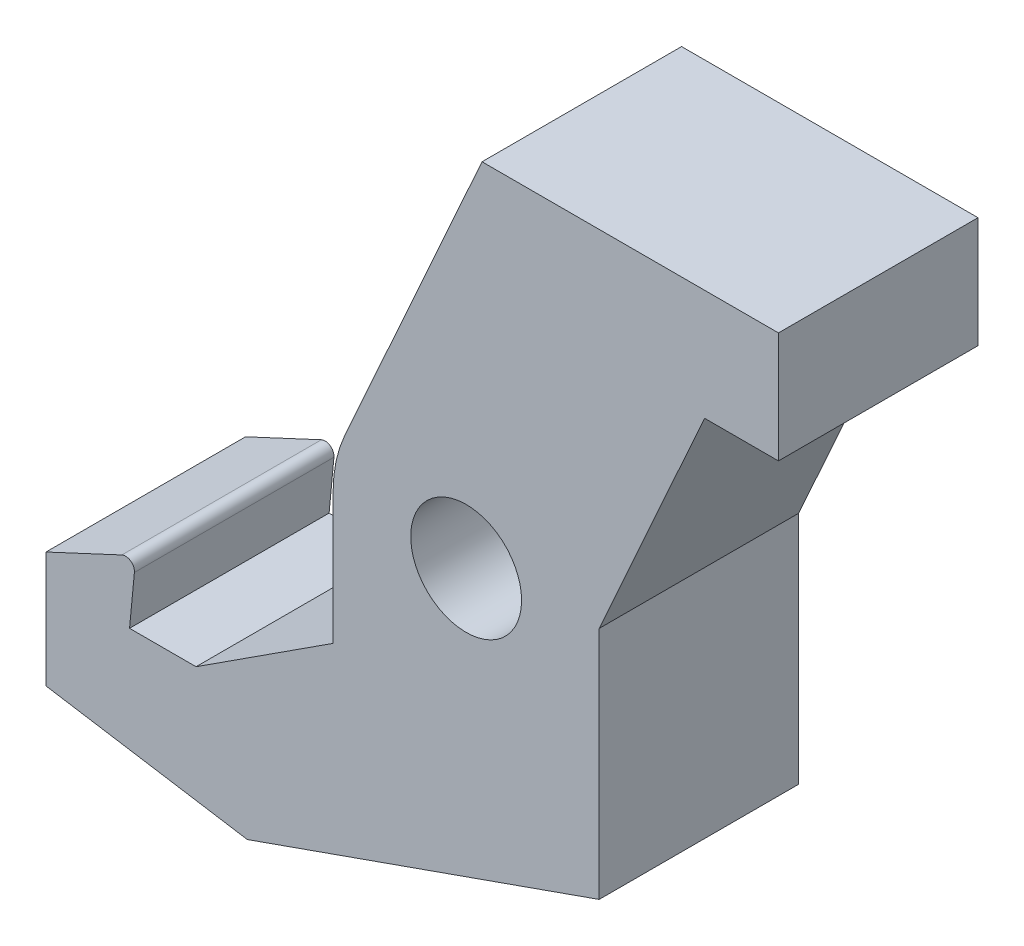
ISO-10303-21;
HEADER;
FILE_DESCRIPTION(('STEP AP214'),'2;1');
FILE_NAME('part.step','',(''),(''),'','','');
FILE_SCHEMA(('AUTOMOTIVE_DESIGN { 1 0 10303 214 1 1 1 1 }'));
ENDSEC;
DATA;
#1=APPLICATION_CONTEXT('core data for automotive mechanical design processes');
#2=APPLICATION_PROTOCOL_DEFINITION('international standard','automotive_design',2000,#1);
#3=PRODUCT_CONTEXT('',#1,'mechanical');
#4=PRODUCT('Part','Part','',(#3));
#5=PRODUCT_RELATED_PRODUCT_CATEGORY('part','',(#4));
#6=PRODUCT_DEFINITION_FORMATION('','',#4);
#7=PRODUCT_DEFINITION_CONTEXT('part definition',#1,'design');
#8=PRODUCT_DEFINITION('design','',#6,#7);
#9=PRODUCT_DEFINITION_SHAPE('','',#8);
#10=(LENGTH_UNIT() NAMED_UNIT(*) SI_UNIT(.MILLI.,.METRE.));
#11=(NAMED_UNIT(*) PLANE_ANGLE_UNIT() SI_UNIT($,.RADIAN.));
#12=(NAMED_UNIT(*) SI_UNIT($,.STERADIAN.) SOLID_ANGLE_UNIT());
#13=UNCERTAINTY_MEASURE_WITH_UNIT(LENGTH_MEASURE(1.E-05),#10,'distance_accuracy_value','');
#14=(GEOMETRIC_REPRESENTATION_CONTEXT(3) GLOBAL_UNCERTAINTY_ASSIGNED_CONTEXT((#13)) GLOBAL_UNIT_ASSIGNED_CONTEXT((#10,
#11,#12)) REPRESENTATION_CONTEXT('',''));
#15=CARTESIAN_POINT('',(0.,0.,0.));
#16=DIRECTION('',(0.,0.,1.));
#17=DIRECTION('',(1.,0.,0.));
#18=AXIS2_PLACEMENT_3D('',#15,#16,#17);
#19=CARTESIAN_POINT('',(-14.1034505740258,1.34798128388892,9.));
#20=DIRECTION('',(-0.995463469492192,0.0951445264141177,0.));
#21=DIRECTION('',(-0.0951445264141177,-0.995463469492193,0.));
#22=AXIS2_PLACEMENT_3D('',#19,#20,#21);
#23=PLANE('',#22);
#24=DIRECTION('',(0.0951445264141177,0.995463469492193,0.));
#25=VECTOR('',#24,1.);
#26=CARTESIAN_POINT('',(-14.1034505740258,1.34798128388892,0.));
#27=LINE('',#26,#25);
#28=CARTESIAN_POINT('',(-15.1814621634101,-9.93087202870755,0.));
#29=VERTEX_POINT('',#28);
#30=CARTESIAN_POINT('',(-14.9625493218934,-7.6404645302864,0.));
#31=VERTEX_POINT('',#30);
#32=EDGE_CURVE('E183',#29,#31,#27,.T.);
#33=ORIENTED_EDGE('',*,*,#32,.T.);
#34=DIRECTION('',(0.,0.,-1.));
#35=VECTOR('',#34,1.);
#36=CARTESIAN_POINT('',(-14.9625493218934,-7.6404645302864,9.));
#37=LINE('',#36,#35);
#38=CARTESIAN_POINT('',(-14.9625493218934,-7.6404645302864,9.));
#39=VERTEX_POINT('',#38);
#40=EDGE_CURVE('E11',#39,#31,#37,.T.);
#41=ORIENTED_EDGE('',*,*,#40,.F.);
#42=DIRECTION('',(0.0951445264141177,0.995463469492193,0.));
#43=VECTOR('',#42,1.);
#44=CARTESIAN_POINT('',(-14.1034505740258,1.34798128388892,9.));
#45=LINE('',#44,#43);
#46=CARTESIAN_POINT('',(-15.1814621634101,-9.93087202870755,9.));
#47=VERTEX_POINT('',#46);
#48=EDGE_CURVE('E298',#47,#39,#45,.T.);
#49=ORIENTED_EDGE('',*,*,#48,.F.);
#50=DIRECTION('',(0.,0.,-1.));
#51=VECTOR('',#50,1.);
#52=CARTESIAN_POINT('',(-15.1814621634101,-9.93087202870755,9.));
#53=LINE('',#52,#51);
#54=EDGE_CURVE('E176',#47,#29,#53,.T.);
#55=ORIENTED_EDGE('',*,*,#54,.T.);
#56=EDGE_LOOP('',(#33,#41,#49,#55));
#57=FACE_BOUND('',#56,.T.);
#58=ADVANCED_FACE('F35',(#57),#23,.F.);
#59=CARTESIAN_POINT('',(-15.3607347096903,-7.60240671972075,9.));
#60=DIRECTION('',(0.,0.,-1.));
#61=DIRECTION('',(-1.,0.,0.));
#62=AXIS2_PLACEMENT_3D('',#59,#60,#61);
#63=CYLINDRICAL_SURFACE('',#62,0.399999999999999);
#64=CARTESIAN_POINT('',(-15.3607347096903,-7.60240671972075,0.));
#65=DIRECTION('',(0.,0.,1.));
#66=DIRECTION('',(1.,0.,0.));
#67=AXIS2_PLACEMENT_3D('',#64,#65,#66);
#68=CIRCLE('',#67,0.399999999999999);
#69=CARTESIAN_POINT('',(-15.5297246389411,-7.23985685582368,0.));
#70=VERTEX_POINT('',#69);
#71=EDGE_CURVE('E186',#31,#70,#68,.T.);
#72=ORIENTED_EDGE('',*,*,#71,.T.);
#73=DIRECTION('',(0.,0.,-1.));
#74=VECTOR('',#73,1.);
#75=CARTESIAN_POINT('',(-15.5297246389411,-7.23985685582368,9.));
#76=LINE('',#75,#74);
#77=CARTESIAN_POINT('',(-15.5297246389411,-7.23985685582368,9.));
#78=VERTEX_POINT('',#77);
#79=EDGE_CURVE('E44',#78,#70,#76,.T.);
#80=ORIENTED_EDGE('',*,*,#79,.F.);
#81=CARTESIAN_POINT('',(-15.3607347096903,-7.60240671972075,9.));
#82=DIRECTION('',(0.,0.,1.));
#83=DIRECTION('',(1.,0.,0.));
#84=AXIS2_PLACEMENT_3D('',#81,#82,#83);
#85=CIRCLE('',#84,0.399999999999999);
#86=EDGE_CURVE('E119',#39,#78,#85,.T.);
#87=ORIENTED_EDGE('',*,*,#86,.F.);
#88=ORIENTED_EDGE('',*,*,#40,.T.);
#89=EDGE_LOOP('',(#72,#80,#87,#88));
#90=FACE_BOUND('',#89,.T.);
#91=ADVANCED_FACE('F312',(#90),#63,.T.);
#92=CARTESIAN_POINT('',(0.000466887164870625,-0.00100165660065969,9.));
#93=DIRECTION('',(0.42247482312715,-0.906374659742693,0.));
#94=DIRECTION('',(0.906374659742693,0.42247482312715,0.));
#95=AXIS2_PLACEMENT_3D('',#92,#93,#94);
#96=PLANE('',#95);
#97=DIRECTION('',(-0.906374659742694,-0.42247482312715,0.));
#98=VECTOR('',#97,1.);
#99=CARTESIAN_POINT('',(0.000466887164870625,-0.00100165660065969,0.));
#100=LINE('',#99,#98);
#101=CARTESIAN_POINT('',(-18.9497048612167,-8.83396093185158,0.));
#102=VERTEX_POINT('',#101);
#103=EDGE_CURVE('E188',#70,#102,#100,.T.);
#104=ORIENTED_EDGE('',*,*,#103,.T.);
#105=DIRECTION('',(0.,0.,-1.));
#106=VECTOR('',#105,1.);
#107=CARTESIAN_POINT('',(-18.9497048612167,-8.83396093185158,9.));
#108=LINE('',#107,#106);
#109=CARTESIAN_POINT('',(-18.9497048612167,-8.83396093185158,9.));
#110=VERTEX_POINT('',#109);
#111=EDGE_CURVE('E244',#110,#102,#108,.T.);
#112=ORIENTED_EDGE('',*,*,#111,.F.);
#113=DIRECTION('',(-0.906374659742694,-0.42247482312715,0.));
#114=VECTOR('',#113,1.);
#115=CARTESIAN_POINT('',(0.000466887164870625,-0.00100165660065969,9.));
#116=LINE('',#115,#114);
#117=EDGE_CURVE('E252',#78,#110,#116,.T.);
#118=ORIENTED_EDGE('',*,*,#117,.F.);
#119=ORIENTED_EDGE('',*,*,#79,.T.);
#120=EDGE_LOOP('',(#104,#112,#118,#119));
#121=FACE_BOUND('',#120,.T.);
#122=ADVANCED_FACE('F250',(#121),#96,.F.);
#123=CARTESIAN_POINT('',(-18.9497048612167,0.,9.));
#124=DIRECTION('',(1.,0.,0.));
#125=DIRECTION('',(0.,0.,-1.));
#126=AXIS2_PLACEMENT_3D('',#123,#124,#125);
#127=PLANE('',#126);
#128=DIRECTION('',(0.,-1.,0.));
#129=VECTOR('',#128,1.);
#130=CARTESIAN_POINT('',(-18.9497048612167,0.,0.));
#131=LINE('',#130,#129);
#132=CARTESIAN_POINT('',(-18.9497048612167,-14.0674182249291,0.));
#133=VERTEX_POINT('',#132);
#134=EDGE_CURVE('E190',#102,#133,#131,.T.);
#135=ORIENTED_EDGE('',*,*,#134,.T.);
#136=DIRECTION('',(0.,0.,-1.));
#137=VECTOR('',#136,1.);
#138=CARTESIAN_POINT('',(-18.9497048612167,-14.0674182249291,9.));
#139=LINE('',#138,#137);
#140=CARTESIAN_POINT('',(-18.9497048612167,-14.0674182249291,9.));
#141=VERTEX_POINT('',#140);
#142=EDGE_CURVE('E242',#141,#133,#139,.T.);
#143=ORIENTED_EDGE('',*,*,#142,.F.);
#144=DIRECTION('',(0.,-1.,0.));
#145=VECTOR('',#144,1.);
#146=CARTESIAN_POINT('',(-18.9497048612167,0.,9.));
#147=LINE('',#146,#145);
#148=EDGE_CURVE('E263',#110,#141,#147,.T.);
#149=ORIENTED_EDGE('',*,*,#148,.F.);
#150=ORIENTED_EDGE('',*,*,#111,.T.);
#151=EDGE_LOOP('',(#135,#143,#149,#150));
#152=FACE_BOUND('',#151,.T.);
#153=ADVANCED_FACE('F260',(#152),#127,.F.);
#154=CARTESIAN_POINT('',(-2.68188596345128,-16.6826209182928,9.));
#155=DIRECTION('',(-0.158721391149819,-0.987323412054766,0.));
#156=DIRECTION('',(0.987323412054767,-0.158721391149819,0.));
#157=AXIS2_PLACEMENT_3D('',#154,#155,#156);
#158=PLANE('',#157);
#159=DIRECTION('',(-0.987323412054766,0.158721391149819,0.));
#160=VECTOR('',#159,1.);
#161=CARTESIAN_POINT('',(-2.68188596345128,-16.6826209182928,0.));
#162=LINE('',#161,#160);
#163=CARTESIAN_POINT('',(-9.87153624063795,-15.52681798691,0.));
#164=VERTEX_POINT('',#163);
#165=EDGE_CURVE('E193',#164,#133,#162,.T.);
#166=ORIENTED_EDGE('',*,*,#165,.F.);
#167=DIRECTION('',(0.,0.,-1.));
#168=VECTOR('',#167,1.);
#169=CARTESIAN_POINT('',(-9.87153624063795,-15.52681798691,9.));
#170=LINE('',#169,#168);
#171=CARTESIAN_POINT('',(-9.87153624063795,-15.52681798691,9.));
#172=VERTEX_POINT('',#171);
#173=EDGE_CURVE('E240',#172,#164,#170,.T.);
#174=ORIENTED_EDGE('',*,*,#173,.F.);
#175=DIRECTION('',(-0.987323412054766,0.158721391149819,0.));
#176=VECTOR('',#175,1.);
#177=CARTESIAN_POINT('',(-2.68188596345128,-16.6826209182928,9.));
#178=LINE('',#177,#176);
#179=EDGE_CURVE('E265',#172,#141,#178,.T.);
#180=ORIENTED_EDGE('',*,*,#179,.T.);
#181=ORIENTED_EDGE('',*,*,#142,.T.);
#182=EDGE_LOOP('',(#166,#174,#180,#181));
#183=FACE_BOUND('',#182,.T.);
#184=ADVANCED_FACE('F322',(#183),#158,.T.);
#185=CARTESIAN_POINT('',(3.77766236711659,-10.7144181899577,9.));
#186=DIRECTION('',(0.332515077437282,-0.943097939387463,0.));
#187=DIRECTION('',(0.943097939387463,0.332515077437282,0.));
#188=AXIS2_PLACEMENT_3D('',#185,#186,#187);
#189=PLANE('',#188);
#190=DIRECTION('',(-0.943097939387463,-0.332515077437282,0.));
#191=VECTOR('',#190,1.);
#192=CARTESIAN_POINT('',(3.77766236711659,-10.7144181899577,0.));
#193=LINE('',#192,#191);
#194=CARTESIAN_POINT('',(6.,-9.93087202870755,0.));
#195=VERTEX_POINT('',#194);
#196=EDGE_CURVE('E196',#195,#164,#193,.T.);
#197=ORIENTED_EDGE('',*,*,#196,.F.);
#198=DIRECTION('',(0.,0.,-1.));
#199=VECTOR('',#198,1.);
#200=CARTESIAN_POINT('',(6.,-9.93087202870755,9.));
#201=LINE('',#200,#199);
#202=CARTESIAN_POINT('',(6.,-9.93087202870755,9.));
#203=VERTEX_POINT('',#202);
#204=EDGE_CURVE('E238',#203,#195,#201,.T.);
#205=ORIENTED_EDGE('',*,*,#204,.F.);
#206=DIRECTION('',(-0.943097939387463,-0.332515077437282,0.));
#207=VECTOR('',#206,1.);
#208=CARTESIAN_POINT('',(3.77766236711659,-10.7144181899577,9.));
#209=LINE('',#208,#207);
#210=EDGE_CURVE('E267',#203,#172,#209,.T.);
#211=ORIENTED_EDGE('',*,*,#210,.T.);
#212=ORIENTED_EDGE('',*,*,#173,.T.);
#213=EDGE_LOOP('',(#197,#205,#211,#212));
#214=FACE_BOUND('',#213,.T.);
#215=ADVANCED_FACE('F325',(#214),#189,.T.);
#216=CARTESIAN_POINT('',(6.,0.,9.));
#217=DIRECTION('',(-1.,0.,0.));
#218=DIRECTION('',(0.,0.,1.));
#219=AXIS2_PLACEMENT_3D('',#216,#217,#218);
#220=PLANE('',#219);
#221=DIRECTION('',(0.,1.,0.));
#222=VECTOR('',#221,1.);
#223=CARTESIAN_POINT('',(6.,0.,0.));
#224=LINE('',#223,#222);
#225=CARTESIAN_POINT('',(6.,0.655573525872559,0.));
#226=VERTEX_POINT('',#225);
#227=EDGE_CURVE('E199',#195,#226,#224,.T.);
#228=ORIENTED_EDGE('',*,*,#227,.T.);
#229=DIRECTION('',(0.,0.,-1.));
#230=VECTOR('',#229,1.);
#231=CARTESIAN_POINT('',(6.,0.655573525872559,9.));
#232=LINE('',#231,#230);
#233=CARTESIAN_POINT('',(6.,0.655573525872559,9.));
#234=VERTEX_POINT('',#233);
#235=EDGE_CURVE('E235',#234,#226,#232,.T.);
#236=ORIENTED_EDGE('',*,*,#235,.F.);
#237=DIRECTION('',(0.,1.,0.));
#238=VECTOR('',#237,1.);
#239=CARTESIAN_POINT('',(6.,0.,9.));
#240=LINE('',#239,#238);
#241=EDGE_CURVE('E274',#203,#234,#240,.T.);
#242=ORIENTED_EDGE('',*,*,#241,.F.);
#243=ORIENTED_EDGE('',*,*,#204,.T.);
#244=EDGE_LOOP('',(#228,#236,#242,#243));
#245=FACE_BOUND('',#244,.T.);
#246=ADVANCED_FACE('F329',(#245),#220,.F.);
#247=CARTESIAN_POINT('',(4.747991842048,-2.13228817130656,9.));
#248=DIRECTION('',(-0.912230997214208,0.409676223036647,0.));
#249=DIRECTION('',(-0.409676223036647,-0.912230997214208,0.));
#250=AXIS2_PLACEMENT_3D('',#247,#248,#249);
#251=PLANE('',#250);
#252=DIRECTION('',(0.409676223036647,0.912230997214208,0.));
#253=VECTOR('',#252,1.);
#254=CARTESIAN_POINT('',(4.747991842048,-2.13228817130656,0.));
#255=LINE('',#254,#253);
#256=CARTESIAN_POINT('',(10.7542947383151,11.2420190804527,0.));
#257=VERTEX_POINT('',#256);
#258=EDGE_CURVE('E201',#226,#257,#255,.T.);
#259=ORIENTED_EDGE('',*,*,#258,.T.);
#260=DIRECTION('',(0.,0.,-1.));
#261=VECTOR('',#260,1.);
#262=CARTESIAN_POINT('',(10.7542947383151,11.2420190804527,9.));
#263=LINE('',#262,#261);
#264=CARTESIAN_POINT('',(10.7542947383151,11.2420190804527,9.));
#265=VERTEX_POINT('',#264);
#266=EDGE_CURVE('E232',#265,#257,#263,.T.);
#267=ORIENTED_EDGE('',*,*,#266,.F.);
#268=DIRECTION('',(0.409676223036647,0.912230997214208,0.));
#269=VECTOR('',#268,1.);
#270=CARTESIAN_POINT('',(4.747991842048,-2.13228817130656,9.));
#271=LINE('',#270,#269);
#272=EDGE_CURVE('E276',#234,#265,#271,.T.);
#273=ORIENTED_EDGE('',*,*,#272,.F.);
#274=ORIENTED_EDGE('',*,*,#235,.T.);
#275=EDGE_LOOP('',(#259,#267,#273,#274));
#276=FACE_BOUND('',#275,.T.);
#277=ADVANCED_FACE('F333',(#276),#251,.F.);
#278=CARTESIAN_POINT('',(0.,11.2420190804527,9.));
#279=DIRECTION('',(0.,1.,0.));
#280=DIRECTION('',(0.,0.,1.));
#281=AXIS2_PLACEMENT_3D('',#278,#279,#280);
#282=PLANE('',#281);
#283=DIRECTION('',(1.,0.,0.));
#284=VECTOR('',#283,1.);
#285=CARTESIAN_POINT('',(0.,11.2420190804527,0.));
#286=LINE('',#285,#284);
#287=CARTESIAN_POINT('',(14.0864349101098,11.2420190804527,0.));
#288=VERTEX_POINT('',#287);
#289=EDGE_CURVE('E203',#257,#288,#286,.T.);
#290=ORIENTED_EDGE('',*,*,#289,.T.);
#291=DIRECTION('',(0.,0.,-1.));
#292=VECTOR('',#291,1.);
#293=CARTESIAN_POINT('',(14.0864349101098,11.2420190804527,9.));
#294=LINE('',#293,#292);
#295=CARTESIAN_POINT('',(14.0864349101098,11.2420190804527,9.));
#296=VERTEX_POINT('',#295);
#297=EDGE_CURVE('E229',#296,#288,#294,.T.);
#298=ORIENTED_EDGE('',*,*,#297,.F.);
#299=DIRECTION('',(1.,0.,0.));
#300=VECTOR('',#299,1.);
#301=CARTESIAN_POINT('',(0.,11.2420190804527,9.));
#302=LINE('',#301,#300);
#303=EDGE_CURVE('E278',#265,#296,#302,.T.);
#304=ORIENTED_EDGE('',*,*,#303,.F.);
#305=ORIENTED_EDGE('',*,*,#266,.T.);
#306=EDGE_LOOP('',(#290,#298,#304,#305));
#307=FACE_BOUND('',#306,.T.);
#308=ADVANCED_FACE('F337',(#307),#282,.F.);
#309=CARTESIAN_POINT('',(14.0864349101098,0.,9.));
#310=DIRECTION('',(-1.,0.,0.));
#311=DIRECTION('',(0.,0.,1.));
#312=AXIS2_PLACEMENT_3D('',#309,#310,#311);
#313=PLANE('',#312);
#314=DIRECTION('',(0.,1.,0.));
#315=VECTOR('',#314,1.);
#316=CARTESIAN_POINT('',(14.0864349101098,0.,0.));
#317=LINE('',#316,#315);
#318=CARTESIAN_POINT('',(14.0864349101098,16.2420190804527,0.));
#319=VERTEX_POINT('',#318);
#320=EDGE_CURVE('E205',#288,#319,#317,.T.);
#321=ORIENTED_EDGE('',*,*,#320,.T.);
#322=DIRECTION('',(0.,0.,-1.));
#323=VECTOR('',#322,1.);
#324=CARTESIAN_POINT('',(14.0864349101098,16.2420190804527,9.));
#325=LINE('',#324,#323);
#326=CARTESIAN_POINT('',(14.0864349101098,16.2420190804527,9.));
#327=VERTEX_POINT('',#326);
#328=EDGE_CURVE('E226',#327,#319,#325,.T.);
#329=ORIENTED_EDGE('',*,*,#328,.F.);
#330=DIRECTION('',(0.,1.,0.));
#331=VECTOR('',#330,1.);
#332=CARTESIAN_POINT('',(14.0864349101098,0.,9.));
#333=LINE('',#332,#331);
#334=EDGE_CURVE('E280',#296,#327,#333,.T.);
#335=ORIENTED_EDGE('',*,*,#334,.F.);
#336=ORIENTED_EDGE('',*,*,#297,.T.);
#337=EDGE_LOOP('',(#321,#329,#335,#336));
#338=FACE_BOUND('',#337,.T.);
#339=ADVANCED_FACE('F341',(#338),#313,.F.);
#340=CARTESIAN_POINT('',(0.,16.2420190804527,9.));
#341=DIRECTION('',(0.,-1.,0.));
#342=DIRECTION('',(0.,0.,-1.));
#343=AXIS2_PLACEMENT_3D('',#340,#341,#342);
#344=PLANE('',#343);
#345=DIRECTION('',(-1.,0.,0.));
#346=VECTOR('',#345,1.);
#347=CARTESIAN_POINT('',(0.,16.2420190804527,0.));
#348=LINE('',#347,#346);
#349=CARTESIAN_POINT('',(0.716889727893603,16.2420190804527,0.));
#350=VERTEX_POINT('',#349);
#351=EDGE_CURVE('E207',#319,#350,#348,.T.);
#352=ORIENTED_EDGE('',*,*,#351,.T.);
#353=DIRECTION('',(0.,0.,-1.));
#354=VECTOR('',#353,1.);
#355=CARTESIAN_POINT('',(0.716889727893603,16.2420190804527,9.));
#356=LINE('',#355,#354);
#357=CARTESIAN_POINT('',(0.716889727893603,16.2420190804527,9.));
#358=VERTEX_POINT('',#357);
#359=EDGE_CURVE('E223',#358,#350,#356,.T.);
#360=ORIENTED_EDGE('',*,*,#359,.F.);
#361=DIRECTION('',(-1.,0.,0.));
#362=VECTOR('',#361,1.);
#363=CARTESIAN_POINT('',(0.,16.2420190804527,9.));
#364=LINE('',#363,#362);
#365=EDGE_CURVE('E282',#327,#358,#364,.T.);
#366=ORIENTED_EDGE('',*,*,#365,.F.);
#367=ORIENTED_EDGE('',*,*,#328,.T.);
#368=EDGE_LOOP('',(#352,#360,#366,#367));
#369=FACE_BOUND('',#368,.T.);
#370=ADVANCED_FACE('F345',(#369),#344,.F.);
#371=CARTESIAN_POINT('',(-5.47338598328524,2.45805733821988,9.));
#372=DIRECTION('',(0.912230997214208,-0.409676223036647,0.));
#373=DIRECTION('',(0.409676223036647,0.912230997214208,0.));
#374=AXIS2_PLACEMENT_3D('',#371,#372,#373);
#375=PLANE('',#374);
#376=DIRECTION('',(-0.409676223036647,-0.912230997214208,0.));
#377=VECTOR('',#376,1.);
#378=CARTESIAN_POINT('',(-5.47338598328524,2.45805733821988,0.));
#379=LINE('',#378,#377);
#380=CARTESIAN_POINT('',(-5.47338598328524,2.45805733821988,0.));
#381=VERTEX_POINT('',#380);
#382=EDGE_CURVE('E209',#350,#381,#379,.T.);
#383=ORIENTED_EDGE('',*,*,#382,.T.);
#384=DIRECTION('',(0.,0.,-1.));
#385=VECTOR('',#384,1.);
#386=CARTESIAN_POINT('',(-5.47338598328524,2.45805733821988,9.));
#387=LINE('',#386,#385);
#388=CARTESIAN_POINT('',(-5.47338598328524,2.45805733821988,9.));
#389=VERTEX_POINT('',#388);
#390=EDGE_CURVE('E220',#389,#381,#387,.T.);
#391=ORIENTED_EDGE('',*,*,#390,.F.);
#392=DIRECTION('',(-0.409676223036647,-0.912230997214208,0.));
#393=VECTOR('',#392,1.);
#394=CARTESIAN_POINT('',(-5.47338598328524,2.45805733821988,9.));
#395=LINE('',#394,#393);
#396=EDGE_CURVE('E284',#358,#389,#395,.T.);
#397=ORIENTED_EDGE('',*,*,#396,.F.);
#398=ORIENTED_EDGE('',*,*,#359,.T.);
#399=EDGE_LOOP('',(#383,#391,#397,#398));
#400=FACE_BOUND('',#399,.T.);
#401=ADVANCED_FACE('F290',(#400),#375,.F.);
#402=CARTESIAN_POINT('',(0.,0.,9.));
#403=DIRECTION('',(0.,0.,-1.));
#404=DIRECTION('',(-1.,0.,0.));
#405=AXIS2_PLACEMENT_3D('',#402,#403,#404);
#406=CYLINDRICAL_SURFACE('',#405,6.);
#407=CARTESIAN_POINT('',(0.,0.,0.));
#408=DIRECTION('',(0.,0.,1.));
#409=DIRECTION('',(1.,0.,0.));
#410=AXIS2_PLACEMENT_3D('',#407,#408,#409);
#411=CIRCLE('',#410,6.);
#412=CARTESIAN_POINT('',(-6.,0.,0.));
#413=VERTEX_POINT('',#412);
#414=EDGE_CURVE('E211',#381,#413,#411,.T.);
#415=ORIENTED_EDGE('',*,*,#414,.T.);
#416=DIRECTION('',(0.,0.,-1.));
#417=VECTOR('',#416,1.);
#418=CARTESIAN_POINT('',(-6.,0.,9.));
#419=LINE('',#418,#417);
#420=CARTESIAN_POINT('',(-6.,0.,9.));
#421=VERTEX_POINT('',#420);
#422=EDGE_CURVE('E171',#421,#413,#419,.T.);
#423=ORIENTED_EDGE('',*,*,#422,.F.);
#424=CARTESIAN_POINT('',(0.,0.,9.));
#425=DIRECTION('',(0.,0.,1.));
#426=DIRECTION('',(1.,0.,0.));
#427=AXIS2_PLACEMENT_3D('',#424,#425,#426);
#428=CIRCLE('',#427,6.);
#429=EDGE_CURVE('E162',#389,#421,#428,.T.);
#430=ORIENTED_EDGE('',*,*,#429,.F.);
#431=ORIENTED_EDGE('',*,*,#390,.T.);
#432=EDGE_LOOP('',(#415,#423,#430,#431));
#433=FACE_BOUND('',#432,.T.);
#434=ADVANCED_FACE('F294',(#433),#406,.T.);
#435=CARTESIAN_POINT('',(-6.,0.,9.));
#436=DIRECTION('',(1.,0.,0.));
#437=DIRECTION('',(0.,1.,0.));
#438=AXIS2_PLACEMENT_3D('',#435,#436,#437);
#439=PLANE('',#438);
#440=DIRECTION('',(0.,-1.,0.));
#441=VECTOR('',#440,1.);
#442=CARTESIAN_POINT('',(-6.,0.,0.));
#443=LINE('',#442,#441);
#444=CARTESIAN_POINT('',(-6.,-5.92825221687712,0.));
#445=VERTEX_POINT('',#444);
#446=EDGE_CURVE('E170',#413,#445,#443,.T.);
#447=ORIENTED_EDGE('',*,*,#446,.T.);
#448=DIRECTION('',(0.,0.,-1.));
#449=VECTOR('',#448,1.);
#450=CARTESIAN_POINT('',(-6.,-5.92825221687712,9.));
#451=LINE('',#450,#449);
#452=CARTESIAN_POINT('',(-6.,-5.92825221687712,9.));
#453=VERTEX_POINT('',#452);
#454=EDGE_CURVE('E167',#453,#445,#451,.T.);
#455=ORIENTED_EDGE('',*,*,#454,.F.);
#456=DIRECTION('',(0.,-1.,0.));
#457=VECTOR('',#456,1.);
#458=CARTESIAN_POINT('',(-6.,0.,9.));
#459=LINE('',#458,#457);
#460=EDGE_CURVE('E156',#421,#453,#459,.T.);
#461=ORIENTED_EDGE('',*,*,#460,.F.);
#462=ORIENTED_EDGE('',*,*,#422,.T.);
#463=EDGE_LOOP('',(#447,#455,#461,#462));
#464=FACE_BOUND('',#463,.T.);
#465=ADVANCED_FACE('F168',(#464),#439,.F.);
#466=CARTESIAN_POINT('',(0.93213971090044,-1.43955374850056,9.));
#467=DIRECTION('',(0.543524059424474,-0.839393588745316,0.));
#468=DIRECTION('',(0.839393588745316,0.543524059424474,0.));
#469=AXIS2_PLACEMENT_3D('',#466,#467,#468);
#470=PLANE('',#469);
#471=DIRECTION('',(-0.839393588745316,-0.543524059424474,0.));
#472=VECTOR('',#471,1.);
#473=CARTESIAN_POINT('',(0.93213971090044,-1.43955374850056,0.));
#474=LINE('',#473,#472);
#475=CARTESIAN_POINT('',(-12.1814621634101,-9.93087202870755,0.));
#476=VERTEX_POINT('',#475);
#477=EDGE_CURVE('E105',#445,#476,#474,.T.);
#478=ORIENTED_EDGE('',*,*,#477,.T.);
#479=DIRECTION('',(0.,0.,-1.));
#480=VECTOR('',#479,1.);
#481=CARTESIAN_POINT('',(-12.1814621634101,-9.93087202870755,9.));
#482=LINE('',#481,#480);
#483=CARTESIAN_POINT('',(-12.1814621634101,-9.93087202870755,9.));
#484=VERTEX_POINT('',#483);
#485=EDGE_CURVE('E172',#484,#476,#482,.T.);
#486=ORIENTED_EDGE('',*,*,#485,.F.);
#487=DIRECTION('',(-0.839393588745316,-0.543524059424474,0.));
#488=VECTOR('',#487,1.);
#489=CARTESIAN_POINT('',(0.93213971090044,-1.43955374850056,9.));
#490=LINE('',#489,#488);
#491=EDGE_CURVE('E160',#453,#484,#490,.T.);
#492=ORIENTED_EDGE('',*,*,#491,.F.);
#493=ORIENTED_EDGE('',*,*,#454,.T.);
#494=EDGE_LOOP('',(#478,#486,#492,#493));
#495=FACE_BOUND('',#494,.T.);
#496=ADVANCED_FACE('F174',(#495),#470,.F.);
#497=CARTESIAN_POINT('',(0.,0.,9.));
#498=DIRECTION('',(0.,0.,-1.));
#499=DIRECTION('',(-1.,0.,0.));
#500=AXIS2_PLACEMENT_3D('',#497,#498,#499);
#501=CYLINDRICAL_SURFACE('',#500,2.5);
#502=CARTESIAN_POINT('',(0.,0.,9.));
#503=DIRECTION('',(0.,0.,1.));
#504=DIRECTION('',(1.,0.,0.));
#505=AXIS2_PLACEMENT_3D('',#502,#503,#504);
#506=CIRCLE('',#505,2.5);
#507=CARTESIAN_POINT('',(2.5,0.,9.));
#508=VERTEX_POINT('',#507);
#509=EDGE_CURVE('E216',#508,#508,#506,.T.);
#510=ORIENTED_EDGE('',*,*,#509,.T.);
#511=EDGE_LOOP('',(#510));
#512=FACE_BOUND('',#511,.T.);
#513=CARTESIAN_POINT('',(0.,0.,0.));
#514=DIRECTION('',(0.,0.,1.));
#515=DIRECTION('',(1.,0.,0.));
#516=AXIS2_PLACEMENT_3D('',#513,#514,#515);
#517=CIRCLE('',#516,2.5);
#518=CARTESIAN_POINT('',(2.5,0.,0.));
#519=VERTEX_POINT('',#518);
#520=EDGE_CURVE('E180',#519,#519,#517,.T.);
#521=ORIENTED_EDGE('',*,*,#520,.F.);
#522=EDGE_LOOP('',(#521));
#523=FACE_BOUND('',#522,.T.);
#524=ADVANCED_FACE('F37',(#512,#523),#501,.F.);
#525=CARTESIAN_POINT('',(0.,-9.93087202870755,9.));
#526=DIRECTION('',(0.,-1.,0.));
#527=DIRECTION('',(0.,0.,-1.));
#528=AXIS2_PLACEMENT_3D('',#525,#526,#527);
#529=PLANE('',#528);
#530=DIRECTION('',(-1.,0.,0.));
#531=VECTOR('',#530,1.);
#532=CARTESIAN_POINT('',(0.,-9.93087202870755,0.));
#533=LINE('',#532,#531);
#534=EDGE_CURVE('E111',#476,#29,#533,.T.);
#535=ORIENTED_EDGE('',*,*,#534,.T.);
#536=ORIENTED_EDGE('',*,*,#54,.F.);
#537=DIRECTION('',(-1.,0.,0.));
#538=VECTOR('',#537,1.);
#539=CARTESIAN_POINT('',(0.,-9.93087202870755,9.));
#540=LINE('',#539,#538);
#541=EDGE_CURVE('E52',#484,#47,#540,.T.);
#542=ORIENTED_EDGE('',*,*,#541,.F.);
#543=ORIENTED_EDGE('',*,*,#485,.T.);
#544=EDGE_LOOP('',(#535,#536,#542,#543));
#545=FACE_BOUND('',#544,.T.);
#546=ADVANCED_FACE('F299',(#545),#529,.F.);
#547=CARTESIAN_POINT('',(0.,0.,9.));
#548=DIRECTION('',(0.,0.,1.));
#549=DIRECTION('',(1.,0.,0.));
#550=AXIS2_PLACEMENT_3D('',#547,#548,#549);
#551=PLANE('',#550);
#552=ORIENTED_EDGE('',*,*,#509,.F.);
#553=EDGE_LOOP('',(#552));
#554=FACE_BOUND('',#553,.T.);
#555=ORIENTED_EDGE('',*,*,#48,.T.);
#556=ORIENTED_EDGE('',*,*,#86,.T.);
#557=ORIENTED_EDGE('',*,*,#117,.T.);
#558=ORIENTED_EDGE('',*,*,#148,.T.);
#559=ORIENTED_EDGE('',*,*,#179,.F.);
#560=ORIENTED_EDGE('',*,*,#210,.F.);
#561=ORIENTED_EDGE('',*,*,#241,.T.);
#562=ORIENTED_EDGE('',*,*,#272,.T.);
#563=ORIENTED_EDGE('',*,*,#303,.T.);
#564=ORIENTED_EDGE('',*,*,#334,.T.);
#565=ORIENTED_EDGE('',*,*,#365,.T.);
#566=ORIENTED_EDGE('',*,*,#396,.T.);
#567=ORIENTED_EDGE('',*,*,#429,.T.);
#568=ORIENTED_EDGE('',*,*,#460,.T.);
#569=ORIENTED_EDGE('',*,*,#491,.T.);
#570=ORIENTED_EDGE('',*,*,#541,.T.);
#571=EDGE_LOOP('',(#555,#556,#557,#558,#559,#560,#561,#562,#563,#564,#565,#566,#567,#568,#569,#570));
#572=FACE_BOUND('',#571,.T.);
#573=ADVANCED_FACE('F158',(#554,#572),#551,.T.);
#574=CARTESIAN_POINT('',(0.,0.,0.));
#575=DIRECTION('',(0.,0.,1.));
#576=DIRECTION('',(1.,0.,0.));
#577=AXIS2_PLACEMENT_3D('',#574,#575,#576);
#578=PLANE('',#577);
#579=ORIENTED_EDGE('',*,*,#520,.T.);
#580=EDGE_LOOP('',(#579));
#581=FACE_BOUND('',#580,.T.);
#582=ORIENTED_EDGE('',*,*,#32,.F.);
#583=ORIENTED_EDGE('',*,*,#534,.F.);
#584=ORIENTED_EDGE('',*,*,#477,.F.);
#585=ORIENTED_EDGE('',*,*,#446,.F.);
#586=ORIENTED_EDGE('',*,*,#414,.F.);
#587=ORIENTED_EDGE('',*,*,#382,.F.);
#588=ORIENTED_EDGE('',*,*,#351,.F.);
#589=ORIENTED_EDGE('',*,*,#320,.F.);
#590=ORIENTED_EDGE('',*,*,#289,.F.);
#591=ORIENTED_EDGE('',*,*,#258,.F.);
#592=ORIENTED_EDGE('',*,*,#227,.F.);
#593=ORIENTED_EDGE('',*,*,#196,.T.);
#594=ORIENTED_EDGE('',*,*,#165,.T.);
#595=ORIENTED_EDGE('',*,*,#134,.F.);
#596=ORIENTED_EDGE('',*,*,#103,.F.);
#597=ORIENTED_EDGE('',*,*,#71,.F.);
#598=EDGE_LOOP('',(#582,#583,#584,#585,#586,#587,#588,#589,#590,#591,#592,#593,#594,#595,#596,#597));
#599=FACE_BOUND('',#598,.T.);
#600=ADVANCED_FACE('F256',(#581,#599),#578,.F.);
#601=CLOSED_SHELL('',(#58,#91,#122,#153,#184,#215,#246,#277,#308,#339,#370,#401,#434,#465,#496,
#524,#546,#573,#600));
#602=MANIFOLD_SOLID_BREP('B2',#601);
#603=ADVANCED_BREP_SHAPE_REPRESENTATION('',(#18,#602),#14);
#604=SHAPE_DEFINITION_REPRESENTATION(#9,#603);
ENDSEC;
END-ISO-10303-21;
